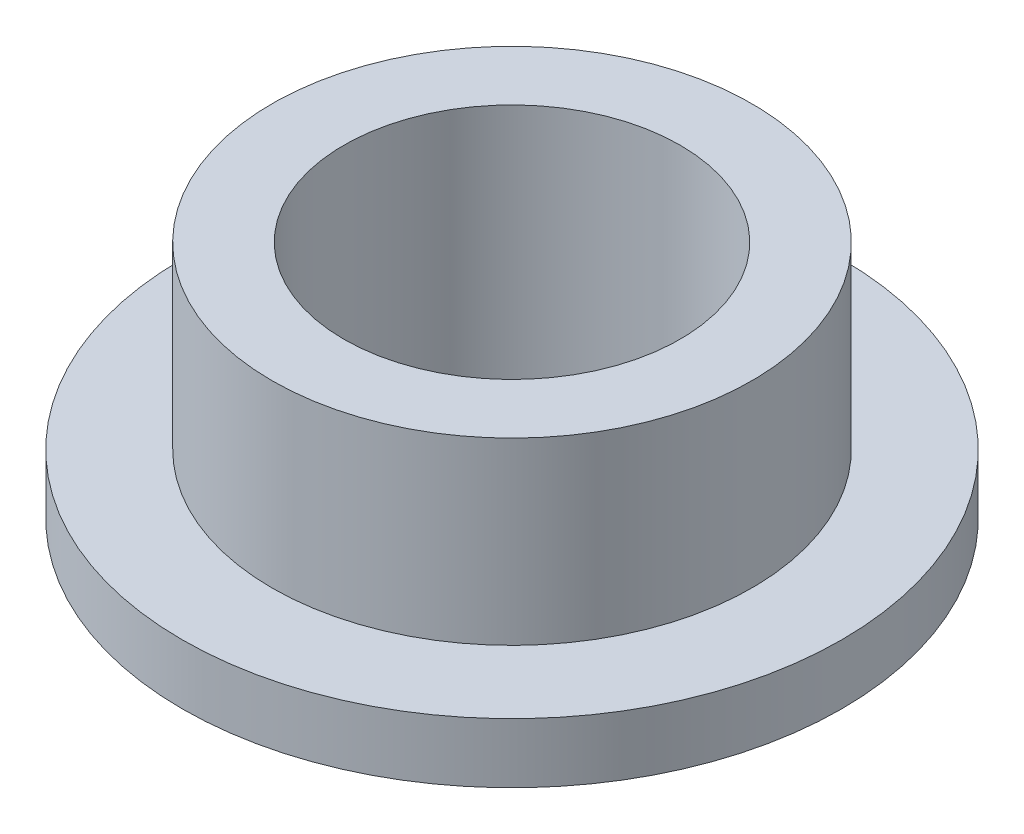
ISO-10303-21;
HEADER;
FILE_DESCRIPTION(('STEP AP214'),'2;1');
FILE_NAME('part.step','',(''),(''),'','','');
FILE_SCHEMA(('AUTOMOTIVE_DESIGN { 1 0 10303 214 1 1 1 1 }'));
ENDSEC;
DATA;
#1=APPLICATION_CONTEXT('core data for automotive mechanical design processes');
#2=APPLICATION_PROTOCOL_DEFINITION('international standard','automotive_design',2000,#1);
#3=PRODUCT_CONTEXT('',#1,'mechanical');
#4=PRODUCT('Part','Part','',(#3));
#5=PRODUCT_RELATED_PRODUCT_CATEGORY('part','',(#4));
#6=PRODUCT_DEFINITION_FORMATION('','',#4);
#7=PRODUCT_DEFINITION_CONTEXT('part definition',#1,'design');
#8=PRODUCT_DEFINITION('design','',#6,#7);
#9=PRODUCT_DEFINITION_SHAPE('','',#8);
#10=(LENGTH_UNIT() NAMED_UNIT(*) SI_UNIT(.MILLI.,.METRE.));
#11=(NAMED_UNIT(*) PLANE_ANGLE_UNIT() SI_UNIT($,.RADIAN.));
#12=(NAMED_UNIT(*) SI_UNIT($,.STERADIAN.) SOLID_ANGLE_UNIT());
#13=UNCERTAINTY_MEASURE_WITH_UNIT(LENGTH_MEASURE(1.E-05),#10,'distance_accuracy_value','');
#14=(GEOMETRIC_REPRESENTATION_CONTEXT(3) GLOBAL_UNCERTAINTY_ASSIGNED_CONTEXT((#13)) GLOBAL_UNIT_ASSIGNED_CONTEXT((#10,
#11,#12)) REPRESENTATION_CONTEXT('',''));
#15=CARTESIAN_POINT('',(0.,0.,0.));
#16=DIRECTION('',(0.,0.,1.));
#17=DIRECTION('',(1.,0.,0.));
#18=AXIS2_PLACEMENT_3D('',#15,#16,#17);
#19=CARTESIAN_POINT('',(0.,15.,0.));
#20=DIRECTION('',(0.,1.,0.));
#21=DIRECTION('',(0.,0.,1.));
#22=AXIS2_PLACEMENT_3D('',#19,#20,#21);
#23=PLANE('',#22);
#24=CARTESIAN_POINT('',(0.,15.,0.));
#25=DIRECTION('',(0.,1.,0.));
#26=DIRECTION('',(0.,0.,1.));
#27=AXIS2_PLACEMENT_3D('',#24,#25,#26);
#28=CIRCLE('',#27,20.05);
#29=CARTESIAN_POINT('',(0.,15.,20.05));
#30=VERTEX_POINT('',#29);
#31=EDGE_CURVE('E10',#30,#30,#28,.T.);
#32=ORIENTED_EDGE('',*,*,#31,.T.);
#33=EDGE_LOOP('',(#32));
#34=FACE_BOUND('',#33,.T.);
#35=CARTESIAN_POINT('',(0.,15.,0.));
#36=DIRECTION('',(0.,1.,0.));
#37=DIRECTION('',(0.,0.,1.));
#38=AXIS2_PLACEMENT_3D('',#35,#36,#37);
#39=CIRCLE('',#38,14.05);
#40=CARTESIAN_POINT('',(0.,15.,14.05));
#41=VERTEX_POINT('',#40);
#42=EDGE_CURVE('E39',#41,#41,#39,.T.);
#43=ORIENTED_EDGE('',*,*,#42,.F.);
#44=EDGE_LOOP('',(#43));
#45=FACE_BOUND('',#44,.T.);
#46=ADVANCED_FACE('F31',(#34,#45),#23,.T.);
#47=CARTESIAN_POINT('',(0.,15.,0.));
#48=DIRECTION('',(0.,-1.,0.));
#49=DIRECTION('',(0.,0.,-1.));
#50=AXIS2_PLACEMENT_3D('',#47,#48,#49);
#51=CYLINDRICAL_SURFACE('',#50,20.05);
#52=ORIENTED_EDGE('',*,*,#31,.F.);
#53=EDGE_LOOP('',(#52));
#54=FACE_BOUND('',#53,.T.);
#55=CARTESIAN_POINT('',(0.,0.,0.));
#56=DIRECTION('',(0.,1.,0.));
#57=DIRECTION('',(0.,0.,1.));
#58=AXIS2_PLACEMENT_3D('',#55,#56,#57);
#59=CIRCLE('',#58,20.05);
#60=CARTESIAN_POINT('',(0.,0.,20.05));
#61=VERTEX_POINT('',#60);
#62=EDGE_CURVE('E35',#61,#61,#59,.T.);
#63=ORIENTED_EDGE('',*,*,#62,.T.);
#64=EDGE_LOOP('',(#63));
#65=FACE_BOUND('',#64,.T.);
#66=ADVANCED_FACE('F33',(#54,#65),#51,.T.);
#67=CARTESIAN_POINT('',(0.,15.,0.));
#68=DIRECTION('',(0.,-1.,0.));
#69=DIRECTION('',(0.,0.,-1.));
#70=AXIS2_PLACEMENT_3D('',#67,#68,#69);
#71=CYLINDRICAL_SURFACE('',#70,14.05);
#72=ORIENTED_EDGE('',*,*,#42,.T.);
#73=EDGE_LOOP('',(#72));
#74=FACE_BOUND('',#73,.T.);
#75=CARTESIAN_POINT('',(0.,-5.,0.));
#76=DIRECTION('',(0.,1.,0.));
#77=DIRECTION('',(0.,0.,1.));
#78=AXIS2_PLACEMENT_3D('',#75,#76,#77);
#79=CIRCLE('',#78,14.05);
#80=CARTESIAN_POINT('',(0.,-5.,14.05));
#81=VERTEX_POINT('',#80);
#82=EDGE_CURVE('E49',#81,#81,#79,.T.);
#83=ORIENTED_EDGE('',*,*,#82,.F.);
#84=EDGE_LOOP('',(#83));
#85=FACE_BOUND('',#84,.T.);
#86=ADVANCED_FACE('F58',(#74,#85),#71,.F.);
#87=CARTESIAN_POINT('',(0.,-5.,0.));
#88=DIRECTION('',(0.,1.,0.));
#89=DIRECTION('',(0.,0.,1.));
#90=AXIS2_PLACEMENT_3D('',#87,#88,#89);
#91=CYLINDRICAL_SURFACE('',#90,27.55);
#92=CARTESIAN_POINT('',(0.,-5.,0.));
#93=DIRECTION('',(0.,1.,0.));
#94=DIRECTION('',(0.,0.,1.));
#95=AXIS2_PLACEMENT_3D('',#92,#93,#94);
#96=CIRCLE('',#95,27.55);
#97=CARTESIAN_POINT('',(0.,-5.,27.55));
#98=VERTEX_POINT('',#97);
#99=EDGE_CURVE('E48',#98,#98,#96,.T.);
#100=ORIENTED_EDGE('',*,*,#99,.T.);
#101=EDGE_LOOP('',(#100));
#102=FACE_BOUND('',#101,.T.);
#103=CARTESIAN_POINT('',(0.,0.,0.));
#104=DIRECTION('',(0.,1.,0.));
#105=DIRECTION('',(0.,0.,1.));
#106=AXIS2_PLACEMENT_3D('',#103,#104,#105);
#107=CIRCLE('',#106,27.55);
#108=CARTESIAN_POINT('',(0.,0.,27.55));
#109=VERTEX_POINT('',#108);
#110=EDGE_CURVE('E45',#109,#109,#107,.T.);
#111=ORIENTED_EDGE('',*,*,#110,.F.);
#112=EDGE_LOOP('',(#111));
#113=FACE_BOUND('',#112,.T.);
#114=ADVANCED_FACE('F60',(#102,#113),#91,.T.);
#115=CARTESIAN_POINT('',(0.,-5.,0.));
#116=DIRECTION('',(0.,1.,0.));
#117=DIRECTION('',(0.,0.,1.));
#118=AXIS2_PLACEMENT_3D('',#115,#116,#117);
#119=PLANE('',#118);
#120=ORIENTED_EDGE('',*,*,#82,.T.);
#121=EDGE_LOOP('',(#120));
#122=FACE_BOUND('',#121,.T.);
#123=ORIENTED_EDGE('',*,*,#99,.F.);
#124=EDGE_LOOP('',(#123));
#125=FACE_BOUND('',#124,.T.);
#126=ADVANCED_FACE('F55',(#122,#125),#119,.F.);
#127=CARTESIAN_POINT('',(0.,0.,0.));
#128=DIRECTION('',(0.,1.,0.));
#129=DIRECTION('',(0.,0.,1.));
#130=AXIS2_PLACEMENT_3D('',#127,#128,#129);
#131=PLANE('',#130);
#132=ORIENTED_EDGE('',*,*,#62,.F.);
#133=EDGE_LOOP('',(#132));
#134=FACE_BOUND('',#133,.T.);
#135=ORIENTED_EDGE('',*,*,#110,.T.);
#136=EDGE_LOOP('',(#135));
#137=FACE_BOUND('',#136,.T.);
#138=ADVANCED_FACE('F99',(#134,#137),#131,.T.);
#139=CLOSED_SHELL('',(#46,#66,#86,#114,#126,#138));
#140=MANIFOLD_SOLID_BREP('B2',#139);
#141=ADVANCED_BREP_SHAPE_REPRESENTATION('',(#18,#140),#14);
#142=SHAPE_DEFINITION_REPRESENTATION(#9,#141);
ENDSEC;
END-ISO-10303-21;
